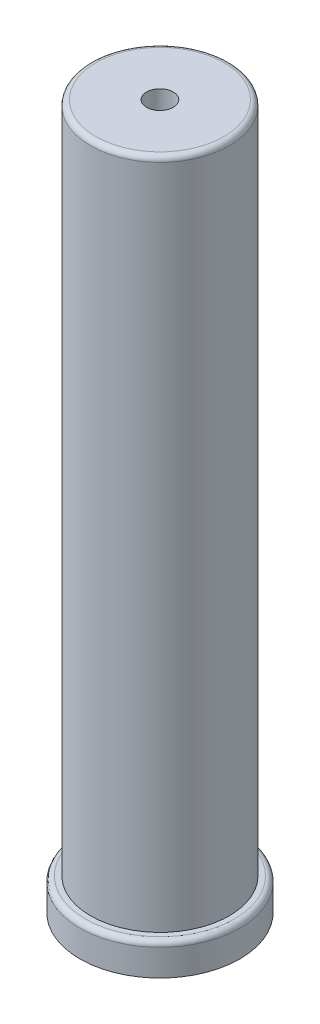
ISO-10303-21;
HEADER;
FILE_DESCRIPTION(('STEP AP214'),'2;1');
FILE_NAME('part.step','',(''),(''),'','','');
FILE_SCHEMA(('AUTOMOTIVE_DESIGN { 1 0 10303 214 1 1 1 1 }'));
ENDSEC;
DATA;
#1=APPLICATION_CONTEXT('core data for automotive mechanical design processes');
#2=APPLICATION_PROTOCOL_DEFINITION('international standard','automotive_design',2000,#1);
#3=PRODUCT_CONTEXT('',#1,'mechanical');
#4=PRODUCT('Part','Part','',(#3));
#5=PRODUCT_RELATED_PRODUCT_CATEGORY('part','',(#4));
#6=PRODUCT_DEFINITION_FORMATION('','',#4);
#7=PRODUCT_DEFINITION_CONTEXT('part definition',#1,'design');
#8=PRODUCT_DEFINITION('design','',#6,#7);
#9=PRODUCT_DEFINITION_SHAPE('','',#8);
#10=(LENGTH_UNIT() NAMED_UNIT(*) SI_UNIT(.MILLI.,.METRE.));
#11=(NAMED_UNIT(*) PLANE_ANGLE_UNIT() SI_UNIT($,.RADIAN.));
#12=(NAMED_UNIT(*) SI_UNIT($,.STERADIAN.) SOLID_ANGLE_UNIT());
#13=UNCERTAINTY_MEASURE_WITH_UNIT(LENGTH_MEASURE(1.E-05),#10,'distance_accuracy_value','');
#14=(GEOMETRIC_REPRESENTATION_CONTEXT(3) GLOBAL_UNCERTAINTY_ASSIGNED_CONTEXT((#13)) GLOBAL_UNIT_ASSIGNED_CONTEXT((#10,
#11,#12)) REPRESENTATION_CONTEXT('',''));
#15=CARTESIAN_POINT('',(0.,0.,0.));
#16=DIRECTION('',(0.,0.,1.));
#17=DIRECTION('',(1.,0.,0.));
#18=AXIS2_PLACEMENT_3D('',#15,#16,#17);
#19=CARTESIAN_POINT('',(0.,3.,0.));
#20=DIRECTION('',(0.,1.,0.));
#21=DIRECTION('',(0.,0.,1.));
#22=AXIS2_PLACEMENT_3D('',#19,#20,#21);
#23=PLANE('',#22);
#24=CARTESIAN_POINT('',(0.,3.,0.));
#25=DIRECTION('',(0.,1.,0.));
#26=DIRECTION('',(0.,0.,1.));
#27=AXIS2_PLACEMENT_3D('',#24,#25,#26);
#28=CIRCLE('',#27,7.);
#29=CARTESIAN_POINT('',(0.,3.,7.));
#30=VERTEX_POINT('',#29);
#31=EDGE_CURVE('E38',#30,#30,#28,.T.);
#32=ORIENTED_EDGE('',*,*,#31,.T.);
#33=EDGE_LOOP('',(#32));
#34=FACE_BOUND('',#33,.T.);
#35=CARTESIAN_POINT('',(0.,3.,0.));
#36=DIRECTION('',(0.,1.,0.));
#37=DIRECTION('',(0.,0.,1.));
#38=AXIS2_PLACEMENT_3D('',#35,#36,#37);
#39=CIRCLE('',#38,6.5);
#40=CARTESIAN_POINT('',(0.,3.,6.5));
#41=VERTEX_POINT('',#40);
#42=EDGE_CURVE('E51',#41,#41,#39,.T.);
#43=ORIENTED_EDGE('',*,*,#42,.F.);
#44=EDGE_LOOP('',(#43));
#45=FACE_BOUND('',#44,.T.);
#46=ADVANCED_FACE('F31',(#34,#45),#23,.T.);
#47=CARTESIAN_POINT('',(0.,0.,0.));
#48=DIRECTION('',(0.,1.,0.));
#49=DIRECTION('',(0.,0.,1.));
#50=AXIS2_PLACEMENT_3D('',#47,#48,#49);
#51=PLANE('',#50);
#52=CARTESIAN_POINT('',(0.,0.,0.));
#53=DIRECTION('',(0.,1.,0.));
#54=DIRECTION('',(0.,0.,1.));
#55=AXIS2_PLACEMENT_3D('',#52,#53,#54);
#56=CIRCLE('',#55,7.5);
#57=CARTESIAN_POINT('',(0.,0.,7.5));
#58=VERTEX_POINT('',#57);
#59=EDGE_CURVE('E52',#58,#58,#56,.T.);
#60=ORIENTED_EDGE('',*,*,#59,.F.);
#61=EDGE_LOOP('',(#60));
#62=FACE_BOUND('',#61,.T.);
#63=CARTESIAN_POINT('',(0.,0.,0.));
#64=DIRECTION('',(0.,1.,0.));
#65=DIRECTION('',(0.,0.,1.));
#66=AXIS2_PLACEMENT_3D('',#63,#64,#65);
#67=CIRCLE('',#66,1.25);
#68=CARTESIAN_POINT('',(0.,0.,1.25));
#69=VERTEX_POINT('',#68);
#70=EDGE_CURVE('E55',#69,#69,#67,.T.);
#71=ORIENTED_EDGE('',*,*,#70,.T.);
#72=EDGE_LOOP('',(#71));
#73=FACE_BOUND('',#72,.T.);
#74=ADVANCED_FACE('F78',(#62,#73),#51,.F.);
#75=CARTESIAN_POINT('',(0.,3.,0.));
#76=DIRECTION('',(0.,-1.,0.));
#77=DIRECTION('',(0.,0.,-1.));
#78=AXIS2_PLACEMENT_3D('',#75,#76,#77);
#79=CYLINDRICAL_SURFACE('',#78,7.5);
#80=CARTESIAN_POINT('',(0.,2.5,0.));
#81=DIRECTION('',(0.,1.,0.));
#82=DIRECTION('',(0.,0.,1.));
#83=AXIS2_PLACEMENT_3D('',#80,#81,#82);
#84=CIRCLE('',#83,7.5);
#85=CARTESIAN_POINT('',(0.,2.5,7.5));
#86=VERTEX_POINT('',#85);
#87=EDGE_CURVE('E10',#86,#86,#84,.F.);
#88=ORIENTED_EDGE('',*,*,#87,.T.);
#89=EDGE_LOOP('',(#88));
#90=FACE_BOUND('',#89,.T.);
#91=ORIENTED_EDGE('',*,*,#59,.T.);
#92=EDGE_LOOP('',(#91));
#93=FACE_BOUND('',#92,.T.);
#94=ADVANCED_FACE('F68',(#90,#93),#79,.T.);
#95=CARTESIAN_POINT('',(0.,3.,0.));
#96=DIRECTION('',(0.,-1.,0.));
#97=DIRECTION('',(0.,0.,-1.));
#98=AXIS2_PLACEMENT_3D('',#95,#96,#97);
#99=CYLINDRICAL_SURFACE('',#98,1.25);
#100=ORIENTED_EDGE('',*,*,#70,.F.);
#101=EDGE_LOOP('',(#100));
#102=FACE_BOUND('',#101,.T.);
#103=CARTESIAN_POINT('',(0.,66.,0.));
#104=DIRECTION('',(0.,-1.,0.));
#105=DIRECTION('',(0.,0.,-1.));
#106=AXIS2_PLACEMENT_3D('',#103,#104,#105);
#107=CIRCLE('',#106,1.25);
#108=CARTESIAN_POINT('',(0.,66.,-1.25));
#109=VERTEX_POINT('',#108);
#110=EDGE_CURVE('E58',#109,#109,#107,.T.);
#111=ORIENTED_EDGE('',*,*,#110,.F.);
#112=EDGE_LOOP('',(#111));
#113=FACE_BOUND('',#112,.T.);
#114=ADVANCED_FACE('F66',(#102,#113),#99,.F.);
#115=CARTESIAN_POINT('',(0.,66.,0.));
#116=DIRECTION('',(0.,1.,0.));
#117=DIRECTION('',(0.,0.,1.));
#118=AXIS2_PLACEMENT_3D('',#115,#116,#117);
#119=PLANE('',#118);
#120=CARTESIAN_POINT('',(0.,66.,0.));
#121=DIRECTION('',(0.,1.,0.));
#122=DIRECTION('',(0.,0.,1.));
#123=AXIS2_PLACEMENT_3D('',#120,#121,#122);
#124=CIRCLE('',#123,6.);
#125=CARTESIAN_POINT('',(0.,66.,6.));
#126=VERTEX_POINT('',#125);
#127=EDGE_CURVE('E46',#126,#126,#124,.T.);
#128=ORIENTED_EDGE('',*,*,#127,.T.);
#129=EDGE_LOOP('',(#128));
#130=FACE_BOUND('',#129,.T.);
#131=ORIENTED_EDGE('',*,*,#110,.T.);
#132=EDGE_LOOP('',(#131));
#133=FACE_BOUND('',#132,.T.);
#134=ADVANCED_FACE('F64',(#130,#133),#119,.T.);
#135=CARTESIAN_POINT('',(0.,66.,0.));
#136=DIRECTION('',(0.,-1.,0.));
#137=DIRECTION('',(0.,0.,-1.));
#138=AXIS2_PLACEMENT_3D('',#135,#136,#137);
#139=CYLINDRICAL_SURFACE('',#138,6.5);
#140=CARTESIAN_POINT('',(0.,65.5,0.));
#141=DIRECTION('',(0.,1.,0.));
#142=DIRECTION('',(0.,0.,1.));
#143=AXIS2_PLACEMENT_3D('',#140,#141,#142);
#144=CIRCLE('',#143,6.5);
#145=CARTESIAN_POINT('',(0.,65.5,6.5));
#146=VERTEX_POINT('',#145);
#147=EDGE_CURVE('E42',#146,#146,#144,.F.);
#148=ORIENTED_EDGE('',*,*,#147,.T.);
#149=EDGE_LOOP('',(#148));
#150=FACE_BOUND('',#149,.T.);
#151=ORIENTED_EDGE('',*,*,#42,.T.);
#152=EDGE_LOOP('',(#151));
#153=FACE_BOUND('',#152,.T.);
#154=ADVANCED_FACE('F75',(#150,#153),#139,.T.);
#155=CARTESIAN_POINT('',(0.,65.5,0.));
#156=DIRECTION('',(0.,1.,0.));
#157=DIRECTION('',(0.,0.,1.));
#158=AXIS2_PLACEMENT_3D('',#155,#156,#157);
#159=TOROIDAL_SURFACE('',#158,6.,0.5);
#160=ORIENTED_EDGE('',*,*,#147,.F.);
#161=EDGE_LOOP('',(#160));
#162=FACE_BOUND('',#161,.T.);
#163=ORIENTED_EDGE('',*,*,#127,.F.);
#164=EDGE_LOOP('',(#163));
#165=FACE_BOUND('',#164,.T.);
#166=ADVANCED_FACE('F90',(#162,#165),#159,.T.);
#167=CARTESIAN_POINT('',(0.,2.5,0.));
#168=DIRECTION('',(0.,1.,0.));
#169=DIRECTION('',(0.,0.,1.));
#170=AXIS2_PLACEMENT_3D('',#167,#168,#169);
#171=TOROIDAL_SURFACE('',#170,7.,0.5);
#172=ORIENTED_EDGE('',*,*,#87,.F.);
#173=EDGE_LOOP('',(#172));
#174=FACE_BOUND('',#173,.T.);
#175=ORIENTED_EDGE('',*,*,#31,.F.);
#176=EDGE_LOOP('',(#175));
#177=FACE_BOUND('',#176,.T.);
#178=ADVANCED_FACE('F33',(#174,#177),#171,.T.);
#179=CLOSED_SHELL('',(#46,#74,#94,#114,#134,#154,#166,#178));
#180=MANIFOLD_SOLID_BREP('B2',#179);
#181=ADVANCED_BREP_SHAPE_REPRESENTATION('',(#18,#180),#14);
#182=SHAPE_DEFINITION_REPRESENTATION(#9,#181);
ENDSEC;
END-ISO-10303-21;
